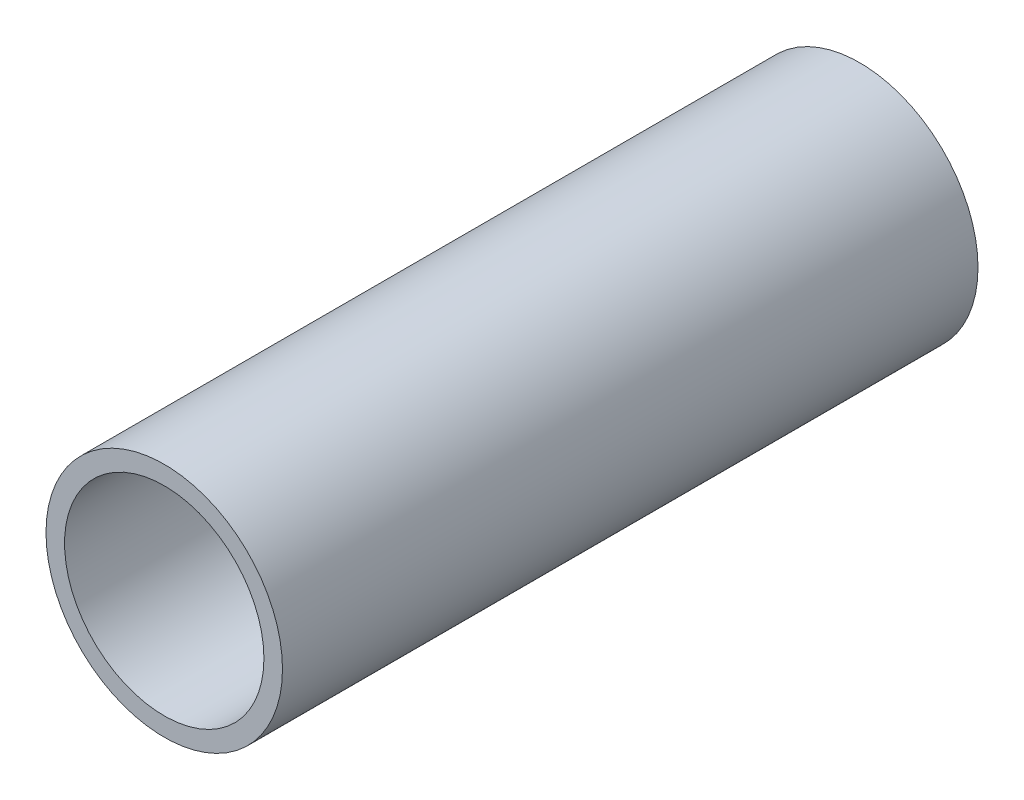
ISO-10303-21;
HEADER;
FILE_DESCRIPTION(('STEP AP214'),'2;1');
FILE_NAME('part.step','',(''),(''),'','','');
FILE_SCHEMA(('AUTOMOTIVE_DESIGN { 1 0 10303 214 1 1 1 1 }'));
ENDSEC;
DATA;
#1=APPLICATION_CONTEXT('core data for automotive mechanical design processes');
#2=APPLICATION_PROTOCOL_DEFINITION('international standard','automotive_design',2000,#1);
#3=PRODUCT_CONTEXT('',#1,'mechanical');
#4=PRODUCT('Part','Part','',(#3));
#5=PRODUCT_RELATED_PRODUCT_CATEGORY('part','',(#4));
#6=PRODUCT_DEFINITION_FORMATION('','',#4);
#7=PRODUCT_DEFINITION_CONTEXT('part definition',#1,'design');
#8=PRODUCT_DEFINITION('design','',#6,#7);
#9=PRODUCT_DEFINITION_SHAPE('','',#8);
#10=(LENGTH_UNIT() NAMED_UNIT(*) SI_UNIT(.MILLI.,.METRE.));
#11=(NAMED_UNIT(*) PLANE_ANGLE_UNIT() SI_UNIT($,.RADIAN.));
#12=(NAMED_UNIT(*) SI_UNIT($,.STERADIAN.) SOLID_ANGLE_UNIT());
#13=UNCERTAINTY_MEASURE_WITH_UNIT(LENGTH_MEASURE(1.E-05),#10,'distance_accuracy_value','');
#14=(GEOMETRIC_REPRESENTATION_CONTEXT(3) GLOBAL_UNCERTAINTY_ASSIGNED_CONTEXT((#13)) GLOBAL_UNIT_ASSIGNED_CONTEXT((#10,
#11,#12)) REPRESENTATION_CONTEXT('',''));
#15=CARTESIAN_POINT('',(0.,0.,0.));
#16=DIRECTION('',(0.,0.,1.));
#17=DIRECTION('',(1.,0.,0.));
#18=AXIS2_PLACEMENT_3D('',#15,#16,#17);
#19=CARTESIAN_POINT('',(0.,0.,15.));
#20=DIRECTION('',(0.,0.,-1.));
#21=DIRECTION('',(-1.,0.,0.));
#22=AXIS2_PLACEMENT_3D('',#19,#20,#21);
#23=CYLINDRICAL_SURFACE('',#22,2.15);
#24=CARTESIAN_POINT('',(0.,0.,15.));
#25=DIRECTION('',(0.,0.,1.));
#26=DIRECTION('',(1.,0.,0.));
#27=AXIS2_PLACEMENT_3D('',#24,#25,#26);
#28=CIRCLE('',#27,2.15);
#29=CARTESIAN_POINT('',(2.15,0.,15.));
#30=VERTEX_POINT('',#29);
#31=EDGE_CURVE('E40',#30,#30,#28,.T.);
#32=ORIENTED_EDGE('',*,*,#31,.T.);
#33=EDGE_LOOP('',(#32));
#34=FACE_BOUND('',#33,.T.);
#35=CARTESIAN_POINT('',(0.,0.,0.));
#36=DIRECTION('',(0.,0.,1.));
#37=DIRECTION('',(1.,0.,0.));
#38=AXIS2_PLACEMENT_3D('',#35,#36,#37);
#39=CIRCLE('',#38,2.15);
#40=CARTESIAN_POINT('',(2.15,0.,0.));
#41=VERTEX_POINT('',#40);
#42=EDGE_CURVE('E46',#41,#41,#39,.T.);
#43=ORIENTED_EDGE('',*,*,#42,.F.);
#44=EDGE_LOOP('',(#43));
#45=FACE_BOUND('',#44,.T.);
#46=ADVANCED_FACE('F33',(#34,#45),#23,.F.);
#47=CARTESIAN_POINT('',(0.,0.,15.));
#48=DIRECTION('',(0.,0.,-1.));
#49=DIRECTION('',(-1.,0.,0.));
#50=AXIS2_PLACEMENT_3D('',#47,#48,#49);
#51=CYLINDRICAL_SURFACE('',#50,2.55);
#52=CARTESIAN_POINT('',(0.,0.,15.));
#53=DIRECTION('',(0.,0.,1.));
#54=DIRECTION('',(1.,0.,0.));
#55=AXIS2_PLACEMENT_3D('',#52,#53,#54);
#56=CIRCLE('',#55,2.55);
#57=CARTESIAN_POINT('',(2.55,0.,15.));
#58=VERTEX_POINT('',#57);
#59=EDGE_CURVE('E10',#58,#58,#56,.T.);
#60=ORIENTED_EDGE('',*,*,#59,.F.);
#61=EDGE_LOOP('',(#60));
#62=FACE_BOUND('',#61,.T.);
#63=CARTESIAN_POINT('',(0.,0.,0.));
#64=DIRECTION('',(0.,0.,1.));
#65=DIRECTION('',(1.,0.,0.));
#66=AXIS2_PLACEMENT_3D('',#63,#64,#65);
#67=CIRCLE('',#66,2.55);
#68=CARTESIAN_POINT('',(2.55,0.,0.));
#69=VERTEX_POINT('',#68);
#70=EDGE_CURVE('E36',#69,#69,#67,.T.);
#71=ORIENTED_EDGE('',*,*,#70,.T.);
#72=EDGE_LOOP('',(#71));
#73=FACE_BOUND('',#72,.T.);
#74=ADVANCED_FACE('F53',(#62,#73),#51,.T.);
#75=CARTESIAN_POINT('',(0.,0.,15.));
#76=DIRECTION('',(0.,0.,1.));
#77=DIRECTION('',(1.,0.,0.));
#78=AXIS2_PLACEMENT_3D('',#75,#76,#77);
#79=PLANE('',#78);
#80=ORIENTED_EDGE('',*,*,#31,.F.);
#81=EDGE_LOOP('',(#80));
#82=FACE_BOUND('',#81,.T.);
#83=ORIENTED_EDGE('',*,*,#59,.T.);
#84=EDGE_LOOP('',(#83));
#85=FACE_BOUND('',#84,.T.);
#86=ADVANCED_FACE('F57',(#82,#85),#79,.T.);
#87=CARTESIAN_POINT('',(0.,0.,0.));
#88=DIRECTION('',(0.,0.,1.));
#89=DIRECTION('',(1.,0.,0.));
#90=AXIS2_PLACEMENT_3D('',#87,#88,#89);
#91=PLANE('',#90);
#92=ORIENTED_EDGE('',*,*,#42,.T.);
#93=EDGE_LOOP('',(#92));
#94=FACE_BOUND('',#93,.T.);
#95=ORIENTED_EDGE('',*,*,#70,.F.);
#96=EDGE_LOOP('',(#95));
#97=FACE_BOUND('',#96,.T.);
#98=ADVANCED_FACE('F55',(#94,#97),#91,.F.);
#99=CLOSED_SHELL('',(#46,#74,#86,#98));
#100=MANIFOLD_SOLID_BREP('B2',#99);
#101=ADVANCED_BREP_SHAPE_REPRESENTATION('',(#18,#100),#14);
#102=SHAPE_DEFINITION_REPRESENTATION(#9,#101);
ENDSEC;
END-ISO-10303-21;
